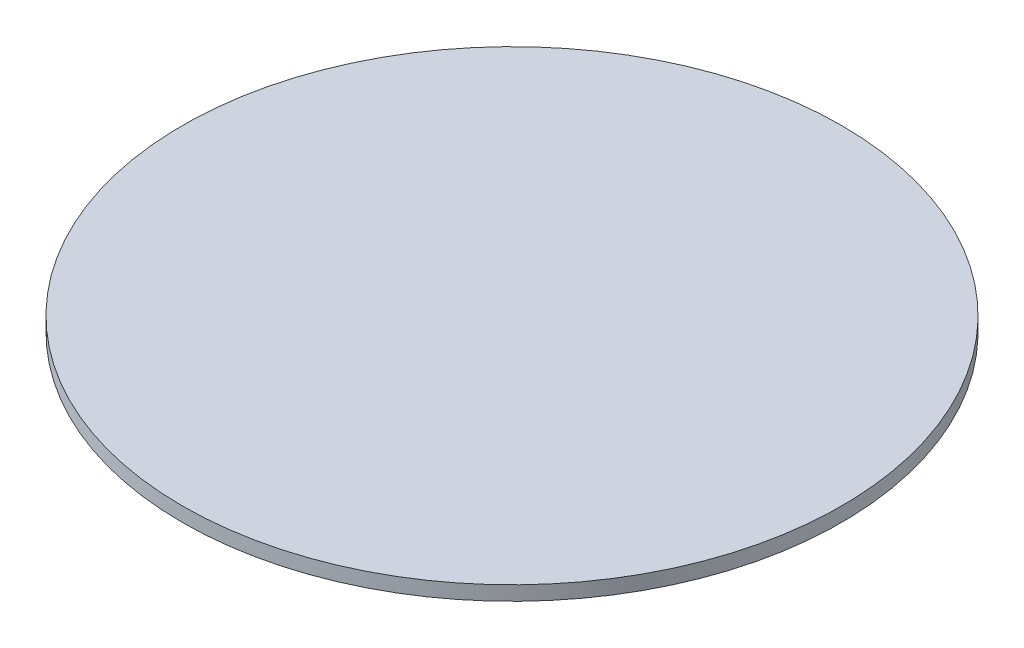
ISO-10303-21;
HEADER;
FILE_DESCRIPTION(('STEP AP214'),'2;1');
FILE_NAME('part.step','',(''),(''),'','','');
FILE_SCHEMA(('AUTOMOTIVE_DESIGN { 1 0 10303 214 1 1 1 1 }'));
ENDSEC;
DATA;
#1=APPLICATION_CONTEXT('core data for automotive mechanical design processes');
#2=APPLICATION_PROTOCOL_DEFINITION('international standard','automotive_design',2000,#1);
#3=PRODUCT_CONTEXT('',#1,'mechanical');
#4=PRODUCT('Part','Part','',(#3));
#5=PRODUCT_RELATED_PRODUCT_CATEGORY('part','',(#4));
#6=PRODUCT_DEFINITION_FORMATION('','',#4);
#7=PRODUCT_DEFINITION_CONTEXT('part definition',#1,'design');
#8=PRODUCT_DEFINITION('design','',#6,#7);
#9=PRODUCT_DEFINITION_SHAPE('','',#8);
#10=(LENGTH_UNIT() NAMED_UNIT(*) SI_UNIT(.MILLI.,.METRE.));
#11=(NAMED_UNIT(*) PLANE_ANGLE_UNIT() SI_UNIT($,.RADIAN.));
#12=(NAMED_UNIT(*) SI_UNIT($,.STERADIAN.) SOLID_ANGLE_UNIT());
#13=UNCERTAINTY_MEASURE_WITH_UNIT(LENGTH_MEASURE(1.E-05),#10,'distance_accuracy_value','');
#14=(GEOMETRIC_REPRESENTATION_CONTEXT(3) GLOBAL_UNCERTAINTY_ASSIGNED_CONTEXT((#13)) GLOBAL_UNIT_ASSIGNED_CONTEXT((#10,
#11,#12)) REPRESENTATION_CONTEXT('',''));
#15=CARTESIAN_POINT('',(0.,0.,0.));
#16=DIRECTION('',(0.,0.,1.));
#17=DIRECTION('',(1.,0.,0.));
#18=AXIS2_PLACEMENT_3D('',#15,#16,#17);
#19=CARTESIAN_POINT('',(0.,0.5,0.));
#20=DIRECTION('',(0.,-1.,0.));
#21=DIRECTION('',(0.,0.,-1.));
#22=AXIS2_PLACEMENT_3D('',#19,#20,#21);
#23=CYLINDRICAL_SURFACE('',#22,11.5);
#24=CARTESIAN_POINT('',(0.,0.5,0.));
#25=DIRECTION('',(0.,1.,0.));
#26=DIRECTION('',(0.,0.,1.));
#27=AXIS2_PLACEMENT_3D('',#24,#25,#26);
#28=CIRCLE('',#27,11.5);
#29=CARTESIAN_POINT('',(0.,0.5,11.5));
#30=VERTEX_POINT('',#29);
#31=EDGE_CURVE('E10',#30,#30,#28,.T.);
#32=ORIENTED_EDGE('',*,*,#31,.F.);
#33=EDGE_LOOP('',(#32));
#34=FACE_BOUND('',#33,.T.);
#35=CARTESIAN_POINT('',(0.,0.,0.));
#36=DIRECTION('',(0.,1.,0.));
#37=DIRECTION('',(0.,0.,1.));
#38=AXIS2_PLACEMENT_3D('',#35,#36,#37);
#39=CIRCLE('',#38,11.5);
#40=CARTESIAN_POINT('',(0.,0.,11.5));
#41=VERTEX_POINT('',#40);
#42=EDGE_CURVE('E42',#41,#41,#39,.T.);
#43=ORIENTED_EDGE('',*,*,#42,.T.);
#44=EDGE_LOOP('',(#43));
#45=FACE_BOUND('',#44,.T.);
#46=ADVANCED_FACE('F39',(#34,#45),#23,.T.);
#47=CARTESIAN_POINT('',(0.,0.5,0.));
#48=DIRECTION('',(0.,1.,0.));
#49=DIRECTION('',(0.,0.,1.));
#50=AXIS2_PLACEMENT_3D('',#47,#48,#49);
#51=PLANE('',#50);
#52=ORIENTED_EDGE('',*,*,#31,.T.);
#53=EDGE_LOOP('',(#52));
#54=FACE_BOUND('',#53,.T.);
#55=ADVANCED_FACE('F54',(#54),#51,.T.);
#56=CARTESIAN_POINT('',(0.,0.,0.));
#57=DIRECTION('',(0.,1.,0.));
#58=DIRECTION('',(0.,0.,1.));
#59=AXIS2_PLACEMENT_3D('',#56,#57,#58);
#60=PLANE('',#59);
#61=ORIENTED_EDGE('',*,*,#42,.F.);
#62=EDGE_LOOP('',(#61));
#63=FACE_BOUND('',#62,.T.);
#64=ADVANCED_FACE('F52',(#63),#60,.F.);
#65=CLOSED_SHELL('',(#46,#55,#64));
#66=MANIFOLD_SOLID_BREP('B2',#65);
#67=ADVANCED_BREP_SHAPE_REPRESENTATION('',(#18,#66),#14);
#68=SHAPE_DEFINITION_REPRESENTATION(#9,#67);
ENDSEC;
END-ISO-10303-21;
